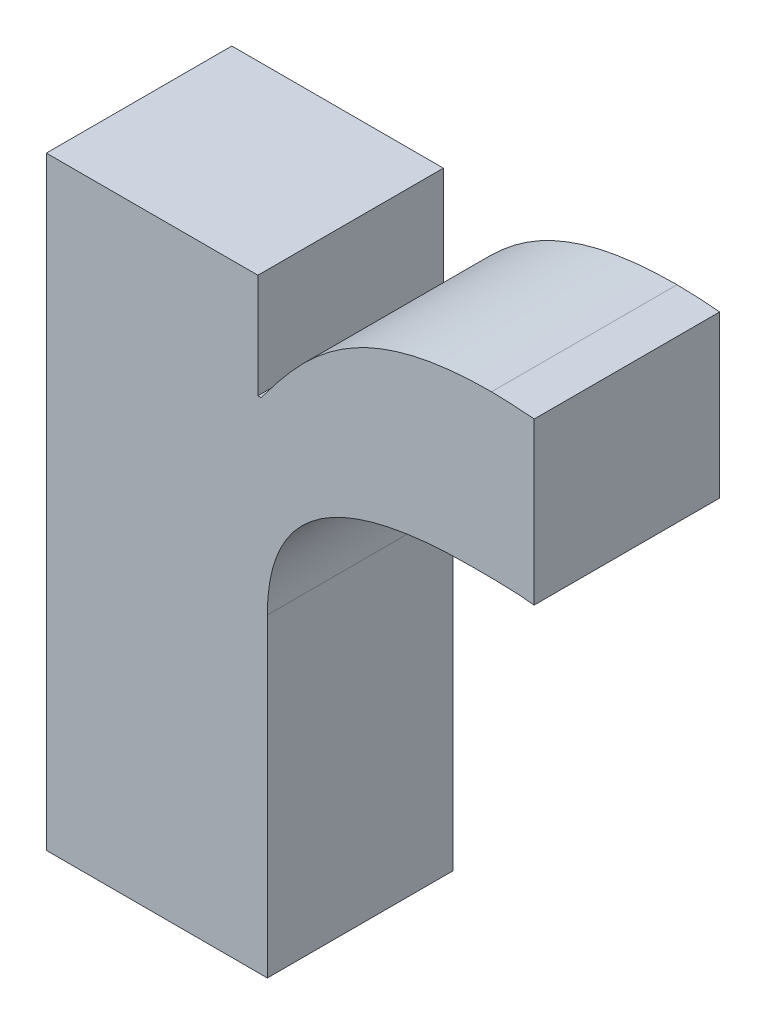
ISO-10303-21;
HEADER;
FILE_DESCRIPTION(('STEP AP214'),'2;1');
FILE_NAME('part.step','',(''),(''),'','','');
FILE_SCHEMA(('AUTOMOTIVE_DESIGN { 1 0 10303 214 1 1 1 1 }'));
ENDSEC;
DATA;
#1=APPLICATION_CONTEXT('core data for automotive mechanical design processes');
#2=APPLICATION_PROTOCOL_DEFINITION('international standard','automotive_design',2000,#1);
#3=PRODUCT_CONTEXT('',#1,'mechanical');
#4=PRODUCT('Part','Part','',(#3));
#5=PRODUCT_RELATED_PRODUCT_CATEGORY('part','',(#4));
#6=PRODUCT_DEFINITION_FORMATION('','',#4);
#7=PRODUCT_DEFINITION_CONTEXT('part definition',#1,'design');
#8=PRODUCT_DEFINITION('design','',#6,#7);
#9=PRODUCT_DEFINITION_SHAPE('','',#8);
#10=(LENGTH_UNIT() NAMED_UNIT(*) SI_UNIT(.MILLI.,.METRE.));
#11=(NAMED_UNIT(*) PLANE_ANGLE_UNIT() SI_UNIT($,.RADIAN.));
#12=(NAMED_UNIT(*) SI_UNIT($,.STERADIAN.) SOLID_ANGLE_UNIT());
#13=UNCERTAINTY_MEASURE_WITH_UNIT(LENGTH_MEASURE(1.E-05),#10,'distance_accuracy_value','');
#14=(GEOMETRIC_REPRESENTATION_CONTEXT(3) GLOBAL_UNCERTAINTY_ASSIGNED_CONTEXT((#13)) GLOBAL_UNIT_ASSIGNED_CONTEXT((#10,
#11,#12)) REPRESENTATION_CONTEXT('',''));
#15=CARTESIAN_POINT('',(0.,0.,0.));
#16=DIRECTION('',(0.,0.,1.));
#17=DIRECTION('',(1.,0.,0.));
#18=AXIS2_PLACEMENT_3D('',#15,#16,#17);
#19=CARTESIAN_POINT('',(-10.37893081036,-0.745407658296,19.2));
#20=DIRECTION('',(0.,0.,-1.));
#21=DIRECTION('',(0.,-1.,0.));
#22=AXIS2_PLACEMENT_3D('',#19,#20,#21);
#23=PLANE('',#22);
#24=DIRECTION('',(1.,0.,0.));
#25=VECTOR('',#24,1.);
#26=CARTESIAN_POINT('',(-11.41844919747,0.508721094143,19.2));
#27=LINE('',#26,#25);
#28=CARTESIAN_POINT('',(-11.4184517061866,0.508721094143,19.2));
#29=VERTEX_POINT('',#28);
#30=CARTESIAN_POINT('',(-10.27773237525,0.508721094143,19.2));
#31=VERTEX_POINT('',#30);
#32=EDGE_CURVE('E200',#29,#31,#27,.T.);
#33=ORIENTED_EDGE('',*,*,#32,.T.);
#34=DIRECTION('',(0.,-1.,0.));
#35=VECTOR('',#34,1.);
#36=CARTESIAN_POINT('',(-10.27773237525,0.508721094143,19.2));
#37=LINE('',#36,#35);
#38=CARTESIAN_POINT('',(-10.27773237525,-0.0543686836340003,19.2));
#39=VERTEX_POINT('',#38);
#40=EDGE_CURVE('E136',#31,#39,#37,.T.);
#41=ORIENTED_EDGE('',*,*,#40,.T.);
#42=DIRECTION('',(1.,0.,0.));
#43=VECTOR('',#42,1.);
#44=CARTESIAN_POINT('',(-10.27773237525,-0.0543686836340003,19.2));
#45=LINE('',#44,#43);
#46=CARTESIAN_POINT('',(-10.26076517525,-0.0543686836340003,19.2));
#47=VERTEX_POINT('',#46);
#48=EDGE_CURVE('E134',#39,#47,#45,.T.);
#49=ORIENTED_EDGE('',*,*,#48,.T.);
#50=CARTESIAN_POINT('',(-10.26076517525,-0.0543686836340003,19.2));
#51=CARTESIAN_POINT('',(-10.01388564192,0.276186916366,19.2));
#52=CARTESIAN_POINT('',(-9.741402908588,0.594440449699,19.2));
#53=CARTESIAN_POINT('',(-9.017782308588,0.594440449699,19.2));
#54=(BOUNDED_CURVE() B_SPLINE_CURVE(3,(#50,#51,#52,#53),.UNSPECIFIED.,.F.,
.F.) B_SPLINE_CURVE_WITH_KNOTS((4,4),(0.,1.),
.UNSPECIFIED.) CURVE() GEOMETRIC_REPRESENTATION_ITEM() RATIONAL_B_SPLINE_CURVE((1.,1.,1.,1.)) REPRESENTATION_ITEM(''));
#55=CARTESIAN_POINT('',(-9.017782308588,0.594440449699,19.2));
#56=VERTEX_POINT('',#55);
#57=EDGE_CURVE('E119',#47,#56,#54,.T.);
#58=ORIENTED_EDGE('',*,*,#57,.T.);
#59=CARTESIAN_POINT('',(-9.017782308588,0.594440449699,19.2));
#60=CARTESIAN_POINT('',(-8.941226708588,0.594440449699,19.2));
#61=CARTESIAN_POINT('',(-8.864682397477,0.588381138588,19.2));
#62=CARTESIAN_POINT('',(-8.78799133081,0.582169427477,19.2));
#63=(BOUNDED_CURVE() B_SPLINE_CURVE(3,(#59,#60,#61,#62),.UNSPECIFIED.,.F.,
.F.) B_SPLINE_CURVE_WITH_KNOTS((4,4),(0.,1.),
.UNSPECIFIED.) CURVE() GEOMETRIC_REPRESENTATION_ITEM() RATIONAL_B_SPLINE_CURVE((1.,1.,1.,1.)) REPRESENTATION_ITEM(''));
#64=CARTESIAN_POINT('',(-8.78799133081,0.582169427477,19.2));
#65=VERTEX_POINT('',#64);
#66=EDGE_CURVE('E247',#56,#65,#63,.T.);
#67=ORIENTED_EDGE('',*,*,#66,.T.);
#68=DIRECTION('',(0.,-1.,0.));
#69=VECTOR('',#68,1.);
#70=CARTESIAN_POINT('',(-8.78799133081,0.582169427477,19.2));
#71=LINE('',#70,#69);
#72=CARTESIAN_POINT('',(-8.78799133081,-0.286905683634,19.2));
#73=VERTEX_POINT('',#72);
#74=EDGE_CURVE('E173',#65,#73,#71,.T.);
#75=ORIENTED_EDGE('',*,*,#74,.T.);
#76=CARTESIAN_POINT('',(-8.78799133081,-0.286905683634,19.2));
#77=CARTESIAN_POINT('',(-8.890068286365,-0.274787061412,19.2));
#78=CARTESIAN_POINT('',(-9.017782308588,-0.274787061412,19.2));
#79=CARTESIAN_POINT('',(-9.128464219699,-0.274787061412,19.2));
#80=(BOUNDED_CURVE() B_SPLINE_CURVE(3,(#76,#77,#78,#79),.UNSPECIFIED.,.F.,
.F.) B_SPLINE_CURVE_WITH_KNOTS((4,4),(0.,1.),
.UNSPECIFIED.) CURVE() GEOMETRIC_REPRESENTATION_ITEM() RATIONAL_B_SPLINE_CURVE((1.,1.,1.,1.)) REPRESENTATION_ITEM(''));
#81=CARTESIAN_POINT('',(-9.128464219699,-0.274787061412,19.2));
#82=VERTEX_POINT('',#81);
#83=EDGE_CURVE('E161',#73,#82,#80,.T.);
#84=ORIENTED_EDGE('',*,*,#83,.T.);
#85=CARTESIAN_POINT('',(-9.128464219699,-0.274787061412,19.2));
#86=CARTESIAN_POINT('',(-10.05636008636,-0.274787061412,19.2));
#87=CARTESIAN_POINT('',(-10.22669530858,-0.690898328079,19.2));
#88=CARTESIAN_POINT('',(-10.22669530858,-1.051990372523,19.2));
#89=(BOUNDED_CURVE() B_SPLINE_CURVE(3,(#85,#86,#87,#88),.UNSPECIFIED.,.F.,
.F.) B_SPLINE_CURVE_WITH_KNOTS((4,4),(0.,1.),
.UNSPECIFIED.) CURVE() GEOMETRIC_REPRESENTATION_ITEM() RATIONAL_B_SPLINE_CURVE((1.,1.,1.,1.)) REPRESENTATION_ITEM(''));
#90=CARTESIAN_POINT('',(-10.22669530858,-1.051990372523,19.2));
#91=VERTEX_POINT('',#90);
#92=EDGE_CURVE('E222',#82,#91,#89,.T.);
#93=ORIENTED_EDGE('',*,*,#92,.T.);
#94=DIRECTION('',(0.,-1.,0.));
#95=VECTOR('',#94,1.);
#96=CARTESIAN_POINT('',(-10.22669530858,-1.051990372523,19.2));
#97=LINE('',#96,#95);
#98=CARTESIAN_POINT('',(-10.22669530858,-2.747392394746,19.2));
#99=VERTEX_POINT('',#98);
#100=EDGE_CURVE('E157',#91,#99,#97,.T.);
#101=ORIENTED_EDGE('',*,*,#100,.T.);
#102=DIRECTION('',(-1.,0.,0.));
#103=VECTOR('',#102,1.);
#104=CARTESIAN_POINT('',(-10.22669530858,-2.747392394746,19.2));
#105=LINE('',#104,#103);
#106=CARTESIAN_POINT('',(-11.41845201969,-2.747392394746,19.2));
#107=VERTEX_POINT('',#106);
#108=EDGE_CURVE('E208',#99,#107,#105,.T.);
#109=ORIENTED_EDGE('',*,*,#108,.T.);
#110=DIRECTION('',(0.,1.,0.));
#111=VECTOR('',#110,1.);
#112=CARTESIAN_POINT('',(-11.41845201969,-2.747392394746,19.2));
#113=LINE('',#112,#111);
#114=EDGE_CURVE('E11',#107,#29,#113,.T.);
#115=ORIENTED_EDGE('',*,*,#114,.T.);
#116=EDGE_LOOP('',(#33,#41,#49,#58,#67,#75,#84,#93,#101,#109,#115));
#117=FACE_BOUND('',#116,.T.);
#118=ADVANCED_FACE('F16',(#117),#23,.T.);
#119=CARTESIAN_POINT('',(-10.37893081036,-0.745407658296,20.2));
#120=DIRECTION('',(0.,0.,-1.));
#121=DIRECTION('',(0.,-1.,0.));
#122=AXIS2_PLACEMENT_3D('',#119,#120,#121);
#123=PLANE('',#122);
#124=DIRECTION('',(0.,1.,0.));
#125=VECTOR('',#124,1.);
#126=CARTESIAN_POINT('',(-11.41845201969,-2.747392394746,20.2));
#127=LINE('',#126,#125);
#128=CARTESIAN_POINT('',(-11.41845201969,-2.747392394746,20.2));
#129=VERTEX_POINT('',#128);
#130=CARTESIAN_POINT('',(-11.4184517061864,0.508721094143,20.2));
#131=VERTEX_POINT('',#130);
#132=EDGE_CURVE('E27',#129,#131,#127,.T.);
#133=ORIENTED_EDGE('',*,*,#132,.F.);
#134=DIRECTION('',(-1.,0.,0.));
#135=VECTOR('',#134,1.);
#136=CARTESIAN_POINT('',(-10.22669530858,-2.747392394746,20.2));
#137=LINE('',#136,#135);
#138=CARTESIAN_POINT('',(-10.22669530858,-2.747392394746,20.2));
#139=VERTEX_POINT('',#138);
#140=EDGE_CURVE('E154',#139,#129,#137,.T.);
#141=ORIENTED_EDGE('',*,*,#140,.F.);
#142=DIRECTION('',(0.,-1.,0.));
#143=VECTOR('',#142,1.);
#144=CARTESIAN_POINT('',(-10.22669530858,-1.051990372523,20.2));
#145=LINE('',#144,#143);
#146=CARTESIAN_POINT('',(-10.22669530858,-1.051990372523,20.2));
#147=VERTEX_POINT('',#146);
#148=EDGE_CURVE('E215',#147,#139,#145,.T.);
#149=ORIENTED_EDGE('',*,*,#148,.F.);
#150=CARTESIAN_POINT('',(-9.128464219699,-0.274787061412,20.2));
#151=CARTESIAN_POINT('',(-10.05636008636,-0.274787061412,20.2));
#152=CARTESIAN_POINT('',(-10.22669530858,-0.690898328079,20.2));
#153=CARTESIAN_POINT('',(-10.22669530858,-1.051990372523,20.2));
#154=(BOUNDED_CURVE() B_SPLINE_CURVE(3,(#150,#151,#152,#153),.UNSPECIFIED.,.F.,
.F.) B_SPLINE_CURVE_WITH_KNOTS((4,4),(0.,1.),
.UNSPECIFIED.) CURVE() GEOMETRIC_REPRESENTATION_ITEM() RATIONAL_B_SPLINE_CURVE((1.,1.,1.,1.)) REPRESENTATION_ITEM(''));
#155=CARTESIAN_POINT('',(-9.128464219699,-0.274787061412,20.2));
#156=VERTEX_POINT('',#155);
#157=EDGE_CURVE('E170',#156,#147,#154,.T.);
#158=ORIENTED_EDGE('',*,*,#157,.F.);
#159=CARTESIAN_POINT('',(-8.78799133081,-0.286905683634,20.2));
#160=CARTESIAN_POINT('',(-8.890068286365,-0.274787061412,20.2));
#161=CARTESIAN_POINT('',(-9.017782308588,-0.274787061412,20.2));
#162=CARTESIAN_POINT('',(-9.128464219699,-0.274787061412,20.2));
#163=(BOUNDED_CURVE() B_SPLINE_CURVE(3,(#159,#160,#161,#162),.UNSPECIFIED.,.F.,
.F.) B_SPLINE_CURVE_WITH_KNOTS((4,4),(0.,1.),
.UNSPECIFIED.) CURVE() GEOMETRIC_REPRESENTATION_ITEM() RATIONAL_B_SPLINE_CURVE((1.,1.,1.,1.)) REPRESENTATION_ITEM(''));
#164=CARTESIAN_POINT('',(-8.78799133081,-0.286905683634,20.2));
#165=VERTEX_POINT('',#164);
#166=EDGE_CURVE('E162',#165,#156,#163,.T.);
#167=ORIENTED_EDGE('',*,*,#166,.F.);
#168=DIRECTION('',(0.,-1.,0.));
#169=VECTOR('',#168,1.);
#170=CARTESIAN_POINT('',(-8.78799133081,0.582169427477,20.2));
#171=LINE('',#170,#169);
#172=CARTESIAN_POINT('',(-8.78799133081,0.582169427477,20.2));
#173=VERTEX_POINT('',#172);
#174=EDGE_CURVE('E207',#173,#165,#171,.T.);
#175=ORIENTED_EDGE('',*,*,#174,.F.);
#176=CARTESIAN_POINT('',(-9.017782308588,0.594440449699,20.2));
#177=CARTESIAN_POINT('',(-8.941226708588,0.594440449699,20.2));
#178=CARTESIAN_POINT('',(-8.864682397477,0.588381138588,20.2));
#179=CARTESIAN_POINT('',(-8.78799133081,0.582169427477,20.2));
#180=(BOUNDED_CURVE() B_SPLINE_CURVE(3,(#176,#177,#178,#179),.UNSPECIFIED.,.F.,
.F.) B_SPLINE_CURVE_WITH_KNOTS((4,4),(0.,1.),
.UNSPECIFIED.) CURVE() GEOMETRIC_REPRESENTATION_ITEM() RATIONAL_B_SPLINE_CURVE((1.,1.,1.,1.)) REPRESENTATION_ITEM(''));
#181=CARTESIAN_POINT('',(-9.017782308588,0.594440449699,20.2));
#182=VERTEX_POINT('',#181);
#183=EDGE_CURVE('E131',#182,#173,#180,.T.);
#184=ORIENTED_EDGE('',*,*,#183,.F.);
#185=CARTESIAN_POINT('',(-10.26076517525,-0.0543686836340003,20.2));
#186=CARTESIAN_POINT('',(-10.01388564192,0.276186916366,20.2));
#187=CARTESIAN_POINT('',(-9.741402908588,0.594440449699,20.2));
#188=CARTESIAN_POINT('',(-9.017782308588,0.594440449699,20.2));
#189=(BOUNDED_CURVE() B_SPLINE_CURVE(3,(#185,#186,#187,#188),.UNSPECIFIED.,.F.,
.F.) B_SPLINE_CURVE_WITH_KNOTS((4,4),(0.,1.),
.UNSPECIFIED.) CURVE() GEOMETRIC_REPRESENTATION_ITEM() RATIONAL_B_SPLINE_CURVE((1.,1.,1.,1.)) REPRESENTATION_ITEM(''));
#190=CARTESIAN_POINT('',(-10.26076517525,-0.0543686836340003,20.2));
#191=VERTEX_POINT('',#190);
#192=EDGE_CURVE('E141',#191,#182,#189,.T.);
#193=ORIENTED_EDGE('',*,*,#192,.F.);
#194=DIRECTION('',(1.,0.,0.));
#195=VECTOR('',#194,1.);
#196=CARTESIAN_POINT('',(-10.27773237525,-0.0543686836340003,20.2));
#197=LINE('',#196,#195);
#198=CARTESIAN_POINT('',(-10.27773237525,-0.0543686836340003,20.2));
#199=VERTEX_POINT('',#198);
#200=EDGE_CURVE('E145',#199,#191,#197,.T.);
#201=ORIENTED_EDGE('',*,*,#200,.F.);
#202=DIRECTION('',(0.,-1.,0.));
#203=VECTOR('',#202,1.);
#204=CARTESIAN_POINT('',(-10.27773237525,0.508721094143,20.2));
#205=LINE('',#204,#203);
#206=CARTESIAN_POINT('',(-10.27773237525,0.508721094143,20.2));
#207=VERTEX_POINT('',#206);
#208=EDGE_CURVE('E195',#207,#199,#205,.T.);
#209=ORIENTED_EDGE('',*,*,#208,.F.);
#210=DIRECTION('',(1.,0.,0.));
#211=VECTOR('',#210,1.);
#212=CARTESIAN_POINT('',(-11.41844919747,0.508721094143,20.2));
#213=LINE('',#212,#211);
#214=EDGE_CURVE('E225',#131,#207,#213,.T.);
#215=ORIENTED_EDGE('',*,*,#214,.F.);
#216=EDGE_LOOP('',(#133,#141,#149,#158,#167,#175,#184,#193,#201,#209,#215));
#217=FACE_BOUND('',#216,.T.);
#218=ADVANCED_FACE('F18',(#217),#123,.F.);
#219=CARTESIAN_POINT('',(-11.41845201969,-1.1193356503015,19.19));
#220=DIRECTION('',(1.,0.,0.));
#221=DIRECTION('',(0.,1.,0.));
#222=AXIS2_PLACEMENT_3D('',#219,#220,#221);
#223=PLANE('',#222);
#224=DIRECTION('',(0.,0.,-1.));
#225=VECTOR('',#224,1.);
#226=CARTESIAN_POINT('',(-11.41845201969,-2.747392394746,20.2));
#227=LINE('',#226,#225);
#228=EDGE_CURVE('E156',#129,#107,#227,.T.);
#229=ORIENTED_EDGE('',*,*,#228,.F.);
#230=ORIENTED_EDGE('',*,*,#132,.T.);
#231=DIRECTION('',(0.,0.,-1.));
#232=VECTOR('',#231,1.);
#233=CARTESIAN_POINT('',(-11.41845201969,0.508721094143,19.19));
#234=LINE('',#233,#232);
#235=EDGE_CURVE('E223',#131,#29,#234,.T.);
#236=ORIENTED_EDGE('',*,*,#235,.T.);
#237=ORIENTED_EDGE('',*,*,#114,.F.);
#238=EDGE_LOOP('',(#229,#230,#236,#237));
#239=FACE_BOUND('',#238,.T.);
#240=ADVANCED_FACE('F307',(#239),#223,.F.);
#241=CARTESIAN_POINT('',(-10.822573664135,-2.747392394746,19.19));
#242=DIRECTION('',(0.,1.,0.));
#243=DIRECTION('',(1.,0.,0.));
#244=AXIS2_PLACEMENT_3D('',#241,#242,#243);
#245=PLANE('',#244);
#246=DIRECTION('',(0.,0.,-1.));
#247=VECTOR('',#246,1.);
#248=CARTESIAN_POINT('',(-10.22669530858,-2.747392394746,20.2));
#249=LINE('',#248,#247);
#250=EDGE_CURVE('E20',#139,#99,#249,.T.);
#251=ORIENTED_EDGE('',*,*,#250,.F.);
#252=ORIENTED_EDGE('',*,*,#140,.T.);
#253=ORIENTED_EDGE('',*,*,#228,.T.);
#254=ORIENTED_EDGE('',*,*,#108,.F.);
#255=EDGE_LOOP('',(#251,#252,#253,#254));
#256=FACE_BOUND('',#255,.T.);
#257=ADVANCED_FACE('F288',(#256),#245,.F.);
#258=CARTESIAN_POINT('',(-10.22669530858,-1.8996913836345,19.19));
#259=DIRECTION('',(-1.,0.,0.));
#260=DIRECTION('',(0.,0.,1.));
#261=AXIS2_PLACEMENT_3D('',#258,#259,#260);
#262=PLANE('',#261);
#263=DIRECTION('',(0.,0.,-1.));
#264=VECTOR('',#263,1.);
#265=CARTESIAN_POINT('',(-10.22669530858,-1.051990372523,20.2));
#266=LINE('',#265,#264);
#267=EDGE_CURVE('E237',#147,#91,#266,.T.);
#268=ORIENTED_EDGE('',*,*,#267,.F.);
#269=ORIENTED_EDGE('',*,*,#148,.T.);
#270=ORIENTED_EDGE('',*,*,#250,.T.);
#271=ORIENTED_EDGE('',*,*,#100,.F.);
#272=EDGE_LOOP('',(#268,#269,#270,#271));
#273=FACE_BOUND('',#272,.T.);
#274=ADVANCED_FACE('F278',(#273),#262,.F.);
#275=CARTESIAN_POINT('',(-9.128464219699,-0.274787061412,19.199));
#276=CARTESIAN_POINT('',(-9.128464219699,-0.274787061412,20.201));
#277=CARTESIAN_POINT('',(-10.05636008636,-0.274787061412,19.199));
#278=CARTESIAN_POINT('',(-10.05636008636,-0.274787061412,20.201));
#279=CARTESIAN_POINT('',(-10.22669530858,-0.690898328079,19.199));
#280=CARTESIAN_POINT('',(-10.22669530858,-0.690898328079,20.201));
#281=CARTESIAN_POINT('',(-10.22669530858,-1.051990372523,19.199));
#282=CARTESIAN_POINT('',(-10.22669530858,-1.051990372523,20.201));
#283=(BOUNDED_SURFACE() B_SPLINE_SURFACE(3,1,((#275,#276),(#277,#278),(#279,#280),(#281,#282)),
.UNSPECIFIED.,.F.,.F.,.F.) B_SPLINE_SURFACE_WITH_KNOTS((4,4),(2,2),(0.,1.),(-1.001,0.001),
.UNSPECIFIED.) GEOMETRIC_REPRESENTATION_ITEM() RATIONAL_B_SPLINE_SURFACE(((1.,1.),(1.,1.),(1.,
1.),(1.,1.))) REPRESENTATION_ITEM('') SURFACE());
#284=DIRECTION('',(0.,0.,-1.));
#285=VECTOR('',#284,1.);
#286=CARTESIAN_POINT('',(-9.128464219699,-0.274787061412,20.2));
#287=LINE('',#286,#285);
#288=EDGE_CURVE('E158',#156,#82,#287,.T.);
#289=ORIENTED_EDGE('',*,*,#288,.F.);
#290=ORIENTED_EDGE('',*,*,#157,.T.);
#291=ORIENTED_EDGE('',*,*,#267,.T.);
#292=ORIENTED_EDGE('',*,*,#92,.F.);
#293=EDGE_LOOP('',(#289,#290,#291,#292));
#294=FACE_BOUND('',#293,.T.);
#295=ADVANCED_FACE('F276',(#294),#283,.F.);
#296=CARTESIAN_POINT('',(-8.78799133081,-0.286905683634,19.1967572623563));
#297=CARTESIAN_POINT('',(-8.78799133081,-0.286905683634,20.2032427376437));
#298=CARTESIAN_POINT('',(-8.890068286365,-0.274787061412,19.1967572623563));
#299=CARTESIAN_POINT('',(-8.890068286365,-0.274787061412,20.2032427376437));
#300=CARTESIAN_POINT('',(-9.017782308588,-0.274787061412,19.1967572623563));
#301=CARTESIAN_POINT('',(-9.017782308588,-0.274787061412,20.2032427376437));
#302=CARTESIAN_POINT('',(-9.128464219699,-0.274787061412,19.1967572623563));
#303=CARTESIAN_POINT('',(-9.128464219699,-0.274787061412,20.2032427376437));
#304=(BOUNDED_SURFACE() B_SPLINE_SURFACE(3,1,((#296,#297),(#298,#299),(#300,#301),(#302,#303)),
.UNSPECIFIED.,.F.,.F.,.F.) B_SPLINE_SURFACE_WITH_KNOTS((4,4),(2,2),(0.,1.),(-1.00324273764364,
0.003242737643635),
.UNSPECIFIED.) GEOMETRIC_REPRESENTATION_ITEM() RATIONAL_B_SPLINE_SURFACE(((1.,1.),(1.,1.),(1.,
1.),(1.,1.))) REPRESENTATION_ITEM('') SURFACE());
#305=DIRECTION('',(0.,0.,-1.));
#306=VECTOR('',#305,1.);
#307=CARTESIAN_POINT('',(-8.78799133081,-0.286905683634,20.2));
#308=LINE('',#307,#306);
#309=EDGE_CURVE('E180',#165,#73,#308,.T.);
#310=ORIENTED_EDGE('',*,*,#309,.F.);
#311=ORIENTED_EDGE('',*,*,#166,.T.);
#312=ORIENTED_EDGE('',*,*,#288,.T.);
#313=ORIENTED_EDGE('',*,*,#83,.F.);
#314=EDGE_LOOP('',(#310,#311,#312,#313));
#315=FACE_BOUND('',#314,.T.);
#316=ADVANCED_FACE('F358',(#315),#304,.F.);
#317=CARTESIAN_POINT('',(-8.78799133081,0.1476318719215,19.19));
#318=DIRECTION('',(-1.,0.,0.));
#319=DIRECTION('',(0.,0.,1.));
#320=AXIS2_PLACEMENT_3D('',#317,#318,#319);
#321=PLANE('',#320);
#322=DIRECTION('',(0.,0.,-1.));
#323=VECTOR('',#322,1.);
#324=CARTESIAN_POINT('',(-8.78799133081,0.582169427477,20.2));
#325=LINE('',#324,#323);
#326=EDGE_CURVE('E246',#173,#65,#325,.T.);
#327=ORIENTED_EDGE('',*,*,#326,.F.);
#328=ORIENTED_EDGE('',*,*,#174,.T.);
#329=ORIENTED_EDGE('',*,*,#309,.T.);
#330=ORIENTED_EDGE('',*,*,#74,.F.);
#331=EDGE_LOOP('',(#327,#328,#329,#330));
#332=FACE_BOUND('',#331,.T.);
#333=ADVANCED_FACE('F298',(#332),#321,.F.);
#334=CARTESIAN_POINT('',(-9.017782308588,0.594440449699,19.1956458660982));
#335=CARTESIAN_POINT('',(-9.017782308588,0.594440449699,20.2043541339018));
#336=CARTESIAN_POINT('',(-8.941226708588,0.594440449699,19.1956458660982));
#337=CARTESIAN_POINT('',(-8.941226708588,0.594440449699,20.2043541339018));
#338=CARTESIAN_POINT('',(-8.864682397477,0.588381138588,19.1956458660982));
#339=CARTESIAN_POINT('',(-8.864682397477,0.588381138588,20.2043541339018));
#340=CARTESIAN_POINT('',(-8.78799133081,0.582169427477,19.1956458660982));
#341=CARTESIAN_POINT('',(-8.78799133081,0.582169427477,20.2043541339018));
#342=(BOUNDED_SURFACE() B_SPLINE_SURFACE(3,1,((#334,#335),(#336,#337),(#338,#339),(#340,#341)),
.UNSPECIFIED.,.F.,.F.,.F.) B_SPLINE_SURFACE_WITH_KNOTS((4,4),(2,2),(0.,1.),(-1.00435413390181,
0.00435413390180901),
.UNSPECIFIED.) GEOMETRIC_REPRESENTATION_ITEM() RATIONAL_B_SPLINE_SURFACE(((1.,1.),(1.,1.),(1.,
1.),(1.,1.))) REPRESENTATION_ITEM('') SURFACE());
#343=DIRECTION('',(0.,0.,-1.));
#344=VECTOR('',#343,1.);
#345=CARTESIAN_POINT('',(-9.017782308588,0.594440449699,20.2));
#346=LINE('',#345,#344);
#347=EDGE_CURVE('E127',#182,#56,#346,.T.);
#348=ORIENTED_EDGE('',*,*,#347,.F.);
#349=ORIENTED_EDGE('',*,*,#183,.T.);
#350=ORIENTED_EDGE('',*,*,#326,.T.);
#351=ORIENTED_EDGE('',*,*,#66,.F.);
#352=EDGE_LOOP('',(#348,#349,#350,#351));
#353=FACE_BOUND('',#352,.T.);
#354=ADVANCED_FACE('F293',(#353),#342,.F.);
#355=CARTESIAN_POINT('',(-10.26076517525,-0.0543686836340003,19.199));
#356=CARTESIAN_POINT('',(-10.26076517525,-0.0543686836340003,20.201));
#357=CARTESIAN_POINT('',(-10.01388564192,0.276186916366,19.199));
#358=CARTESIAN_POINT('',(-10.01388564192,0.276186916366,20.201));
#359=CARTESIAN_POINT('',(-9.741402908588,0.594440449699,19.199));
#360=CARTESIAN_POINT('',(-9.741402908588,0.594440449699,20.201));
#361=CARTESIAN_POINT('',(-9.017782308588,0.594440449699,19.199));
#362=CARTESIAN_POINT('',(-9.017782308588,0.594440449699,20.201));
#363=(BOUNDED_SURFACE() B_SPLINE_SURFACE(3,1,((#355,#356),(#357,#358),(#359,#360),(#361,#362)),
.UNSPECIFIED.,.F.,.F.,.F.) B_SPLINE_SURFACE_WITH_KNOTS((4,4),(2,2),(0.,1.),(-1.001,0.001),
.UNSPECIFIED.) GEOMETRIC_REPRESENTATION_ITEM() RATIONAL_B_SPLINE_SURFACE(((1.,1.),(1.,1.),(1.,
1.),(1.,1.))) REPRESENTATION_ITEM('') SURFACE());
#364=DIRECTION('',(0.,0.,-1.));
#365=VECTOR('',#364,1.);
#366=CARTESIAN_POINT('',(-10.26076517525,-0.0543686836340003,20.2));
#367=LINE('',#366,#365);
#368=EDGE_CURVE('E124',#191,#47,#367,.T.);
#369=ORIENTED_EDGE('',*,*,#368,.F.);
#370=ORIENTED_EDGE('',*,*,#192,.T.);
#371=ORIENTED_EDGE('',*,*,#347,.T.);
#372=ORIENTED_EDGE('',*,*,#57,.F.);
#373=EDGE_LOOP('',(#369,#370,#371,#372));
#374=FACE_BOUND('',#373,.T.);
#375=ADVANCED_FACE('F121',(#374),#363,.F.);
#376=CARTESIAN_POINT('',(-10.26924877525,-0.0543686836340003,19.19));
#377=DIRECTION('',(0.,-1.,0.));
#378=DIRECTION('',(0.,0.,-1.));
#379=AXIS2_PLACEMENT_3D('',#376,#377,#378);
#380=PLANE('',#379);
#381=DIRECTION('',(0.,0.,-1.));
#382=VECTOR('',#381,1.);
#383=CARTESIAN_POINT('',(-10.27773237525,-0.0543686836340003,20.2));
#384=LINE('',#383,#382);
#385=EDGE_CURVE('E199',#199,#39,#384,.T.);
#386=ORIENTED_EDGE('',*,*,#385,.F.);
#387=ORIENTED_EDGE('',*,*,#200,.T.);
#388=ORIENTED_EDGE('',*,*,#368,.T.);
#389=ORIENTED_EDGE('',*,*,#48,.F.);
#390=EDGE_LOOP('',(#386,#387,#388,#389));
#391=FACE_BOUND('',#390,.T.);
#392=ADVANCED_FACE('F143',(#391),#380,.F.);
#393=CARTESIAN_POINT('',(-10.27773237525,0.227176205254499,19.19));
#394=DIRECTION('',(-1.,0.,0.));
#395=DIRECTION('',(0.,0.,1.));
#396=AXIS2_PLACEMENT_3D('',#393,#394,#395);
#397=PLANE('',#396);
#398=DIRECTION('',(0.,0.,-1.));
#399=VECTOR('',#398,1.);
#400=CARTESIAN_POINT('',(-10.27773237525,0.508721094143,20.2));
#401=LINE('',#400,#399);
#402=EDGE_CURVE('E203',#207,#31,#401,.T.);
#403=ORIENTED_EDGE('',*,*,#402,.F.);
#404=ORIENTED_EDGE('',*,*,#208,.T.);
#405=ORIENTED_EDGE('',*,*,#385,.T.);
#406=ORIENTED_EDGE('',*,*,#40,.F.);
#407=EDGE_LOOP('',(#403,#404,#405,#406));
#408=FACE_BOUND('',#407,.T.);
#409=ADVANCED_FACE('F342',(#408),#397,.F.);
#410=CARTESIAN_POINT('',(-10.84809078636,0.508721094143,19.19));
#411=DIRECTION('',(0.,-1.,0.));
#412=DIRECTION('',(0.,0.,-1.));
#413=AXIS2_PLACEMENT_3D('',#410,#411,#412);
#414=PLANE('',#413);
#415=ORIENTED_EDGE('',*,*,#235,.F.);
#416=ORIENTED_EDGE('',*,*,#214,.T.);
#417=ORIENTED_EDGE('',*,*,#402,.T.);
#418=ORIENTED_EDGE('',*,*,#32,.F.);
#419=EDGE_LOOP('',(#415,#416,#417,#418));
#420=FACE_BOUND('',#419,.T.);
#421=ADVANCED_FACE('F347',(#420),#414,.F.);
#422=CLOSED_SHELL('',(#118,#218,#240,#257,#274,#295,#316,#333,#354,#375,#392,#409,#421));
#423=MANIFOLD_SOLID_BREP('B1',#422);
#424=ADVANCED_BREP_SHAPE_REPRESENTATION('',(#18,#423),#14);
#425=SHAPE_DEFINITION_REPRESENTATION(#9,#424);
ENDSEC;
END-ISO-10303-21;
